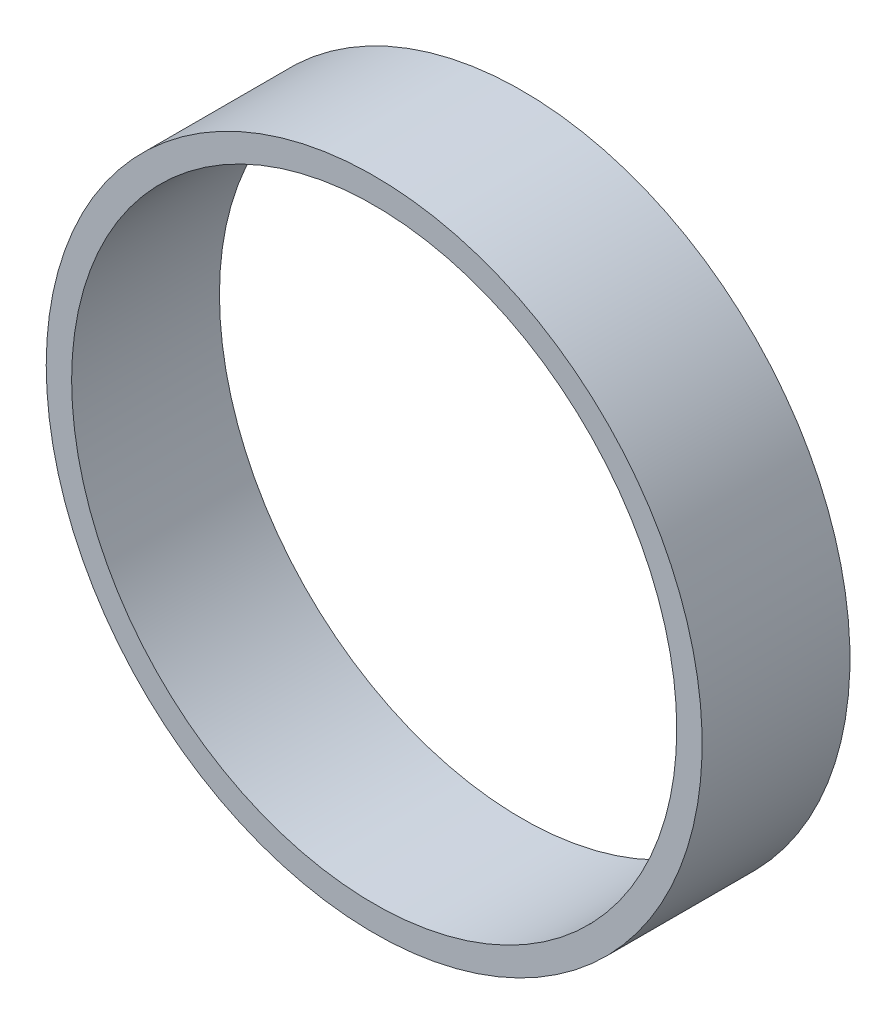
ISO-10303-21;
HEADER;
FILE_DESCRIPTION(('STEP AP214'),'2;1');
FILE_NAME('part.step','',(''),(''),'','','');
FILE_SCHEMA(('AUTOMOTIVE_DESIGN { 1 0 10303 214 1 1 1 1 }'));
ENDSEC;
DATA;
#1=APPLICATION_CONTEXT('core data for automotive mechanical design processes');
#2=APPLICATION_PROTOCOL_DEFINITION('international standard','automotive_design',2000,#1);
#3=PRODUCT_CONTEXT('',#1,'mechanical');
#4=PRODUCT('Part','Part','',(#3));
#5=PRODUCT_RELATED_PRODUCT_CATEGORY('part','',(#4));
#6=PRODUCT_DEFINITION_FORMATION('','',#4);
#7=PRODUCT_DEFINITION_CONTEXT('part definition',#1,'design');
#8=PRODUCT_DEFINITION('design','',#6,#7);
#9=PRODUCT_DEFINITION_SHAPE('','',#8);
#10=(LENGTH_UNIT() NAMED_UNIT(*) SI_UNIT(.MILLI.,.METRE.));
#11=(NAMED_UNIT(*) PLANE_ANGLE_UNIT() SI_UNIT($,.RADIAN.));
#12=(NAMED_UNIT(*) SI_UNIT($,.STERADIAN.) SOLID_ANGLE_UNIT());
#13=UNCERTAINTY_MEASURE_WITH_UNIT(LENGTH_MEASURE(1.E-05),#10,'distance_accuracy_value','');
#14=(GEOMETRIC_REPRESENTATION_CONTEXT(3) GLOBAL_UNCERTAINTY_ASSIGNED_CONTEXT((#13)) GLOBAL_UNIT_ASSIGNED_CONTEXT((#10,
#11,#12)) REPRESENTATION_CONTEXT('',''));
#15=CARTESIAN_POINT('',(0.,0.,0.));
#16=DIRECTION('',(0.,0.,1.));
#17=DIRECTION('',(1.,0.,0.));
#18=AXIS2_PLACEMENT_3D('',#15,#16,#17);
#19=CARTESIAN_POINT('',(0.,0.,-72.6195652173913));
#20=DIRECTION('',(0.,0.,-1.));
#21=DIRECTION('',(-1.,0.,0.));
#22=AXIS2_PLACEMENT_3D('',#19,#20,#21);
#23=CYLINDRICAL_SURFACE('',#22,65.5);
#24=CARTESIAN_POINT('',(0.,0.,-16.));
#25=DIRECTION('',(0.,0.,-1.));
#26=DIRECTION('',(-1.,0.,0.));
#27=AXIS2_PLACEMENT_3D('',#24,#25,#26);
#28=CIRCLE('',#27,65.5);
#29=CARTESIAN_POINT('',(-65.5,0.,-16.));
#30=VERTEX_POINT('',#29);
#31=EDGE_CURVE('E10',#30,#30,#28,.T.);
#32=ORIENTED_EDGE('',*,*,#31,.T.);
#33=EDGE_LOOP('',(#32));
#34=FACE_BOUND('',#33,.T.);
#35=CARTESIAN_POINT('',(0.,0.,16.));
#36=DIRECTION('',(0.,0.,-1.));
#37=DIRECTION('',(-1.,0.,0.));
#38=AXIS2_PLACEMENT_3D('',#35,#36,#37);
#39=CIRCLE('',#38,65.5);
#40=CARTESIAN_POINT('',(-65.5,0.,16.));
#41=VERTEX_POINT('',#40);
#42=EDGE_CURVE('E46',#41,#41,#39,.T.);
#43=ORIENTED_EDGE('',*,*,#42,.F.);
#44=EDGE_LOOP('',(#43));
#45=FACE_BOUND('',#44,.T.);
#46=ADVANCED_FACE('F32',(#34,#45),#23,.F.);
#47=CARTESIAN_POINT('',(-71.,0.,-16.));
#48=DIRECTION('',(0.,0.,-1.));
#49=DIRECTION('',(-1.,0.,0.));
#50=AXIS2_PLACEMENT_3D('',#47,#48,#49);
#51=PLANE('',#50);
#52=CARTESIAN_POINT('',(0.,0.,-16.));
#53=DIRECTION('',(0.,0.,-1.));
#54=DIRECTION('',(-1.,0.,0.));
#55=AXIS2_PLACEMENT_3D('',#52,#53,#54);
#56=CIRCLE('',#55,71.);
#57=CARTESIAN_POINT('',(-71.,0.,-16.));
#58=VERTEX_POINT('',#57);
#59=EDGE_CURVE('E38',#58,#58,#56,.T.);
#60=ORIENTED_EDGE('',*,*,#59,.T.);
#61=EDGE_LOOP('',(#60));
#62=FACE_BOUND('',#61,.T.);
#63=ORIENTED_EDGE('',*,*,#31,.F.);
#64=EDGE_LOOP('',(#63));
#65=FACE_BOUND('',#64,.T.);
#66=ADVANCED_FACE('F56',(#62,#65),#51,.T.);
#67=CARTESIAN_POINT('',(0.,0.,-72.6195652173913));
#68=DIRECTION('',(0.,0.,-1.));
#69=DIRECTION('',(-1.,0.,0.));
#70=AXIS2_PLACEMENT_3D('',#67,#68,#69);
#71=CYLINDRICAL_SURFACE('',#70,71.);
#72=CARTESIAN_POINT('',(0.,0.,16.));
#73=DIRECTION('',(0.,0.,-1.));
#74=DIRECTION('',(-1.,0.,0.));
#75=AXIS2_PLACEMENT_3D('',#72,#73,#74);
#76=CIRCLE('',#75,71.);
#77=CARTESIAN_POINT('',(-71.,0.,16.));
#78=VERTEX_POINT('',#77);
#79=EDGE_CURVE('E42',#78,#78,#76,.T.);
#80=ORIENTED_EDGE('',*,*,#79,.T.);
#81=EDGE_LOOP('',(#80));
#82=FACE_BOUND('',#81,.T.);
#83=ORIENTED_EDGE('',*,*,#59,.F.);
#84=EDGE_LOOP('',(#83));
#85=FACE_BOUND('',#84,.T.);
#86=ADVANCED_FACE('F60',(#82,#85),#71,.T.);
#87=CARTESIAN_POINT('',(-71.,0.,16.));
#88=DIRECTION('',(0.,0.,1.));
#89=DIRECTION('',(1.,0.,0.));
#90=AXIS2_PLACEMENT_3D('',#87,#88,#89);
#91=PLANE('',#90);
#92=ORIENTED_EDGE('',*,*,#42,.T.);
#93=EDGE_LOOP('',(#92));
#94=FACE_BOUND('',#93,.T.);
#95=ORIENTED_EDGE('',*,*,#79,.F.);
#96=EDGE_LOOP('',(#95));
#97=FACE_BOUND('',#96,.T.);
#98=ADVANCED_FACE('F52',(#94,#97),#91,.T.);
#99=CLOSED_SHELL('',(#46,#66,#86,#98));
#100=MANIFOLD_SOLID_BREP('B2',#99);
#101=ADVANCED_BREP_SHAPE_REPRESENTATION('',(#18,#100),#14);
#102=SHAPE_DEFINITION_REPRESENTATION(#9,#101);
ENDSEC;
END-ISO-10303-21;
